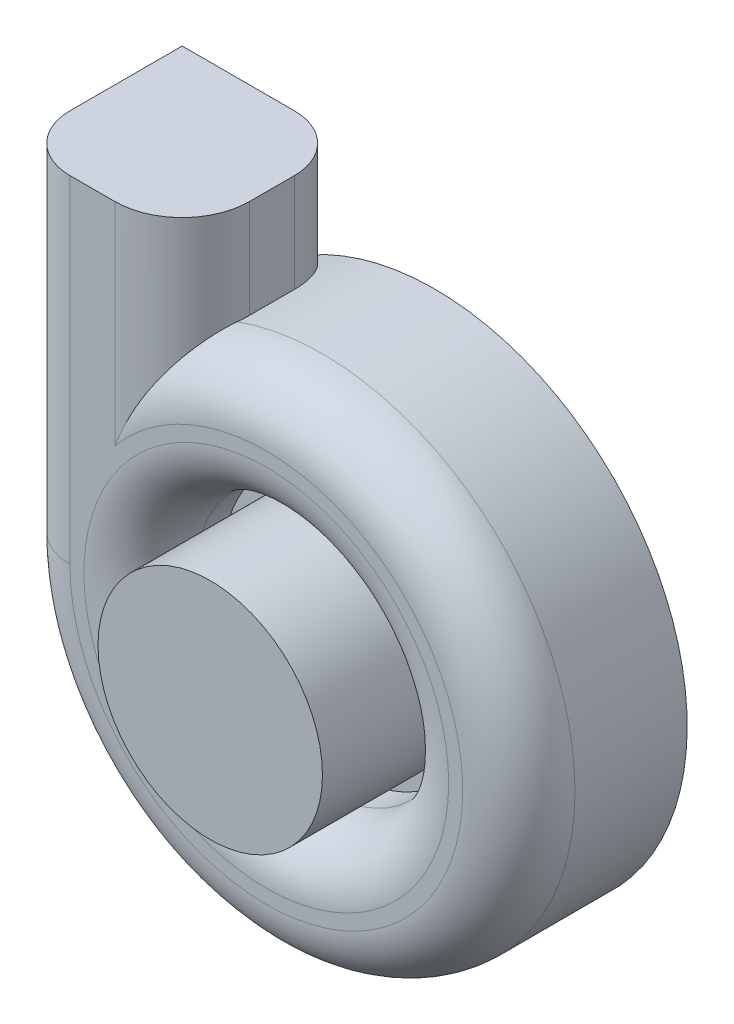
ISO-10303-21;
HEADER;
FILE_DESCRIPTION(('STEP AP214'),'2;1');
FILE_NAME('part.step','',(''),(''),'','','');
FILE_SCHEMA(('AUTOMOTIVE_DESIGN { 1 0 10303 214 1 1 1 1 }'));
ENDSEC;
DATA;
#1=APPLICATION_CONTEXT('core data for automotive mechanical design processes');
#2=APPLICATION_PROTOCOL_DEFINITION('international standard','automotive_design',2000,#1);
#3=PRODUCT_CONTEXT('',#1,'mechanical');
#4=PRODUCT('Part','Part','',(#3));
#5=PRODUCT_RELATED_PRODUCT_CATEGORY('part','',(#4));
#6=PRODUCT_DEFINITION_FORMATION('','',#4);
#7=PRODUCT_DEFINITION_CONTEXT('part definition',#1,'design');
#8=PRODUCT_DEFINITION('design','',#6,#7);
#9=PRODUCT_DEFINITION_SHAPE('','',#8);
#10=(LENGTH_UNIT() NAMED_UNIT(*) SI_UNIT(.MILLI.,.METRE.));
#11=(NAMED_UNIT(*) PLANE_ANGLE_UNIT() SI_UNIT($,.RADIAN.));
#12=(NAMED_UNIT(*) SI_UNIT($,.STERADIAN.) SOLID_ANGLE_UNIT());
#13=UNCERTAINTY_MEASURE_WITH_UNIT(LENGTH_MEASURE(1.E-05),#10,'distance_accuracy_value','');
#14=(GEOMETRIC_REPRESENTATION_CONTEXT(3) GLOBAL_UNCERTAINTY_ASSIGNED_CONTEXT((#13)) GLOBAL_UNIT_ASSIGNED_CONTEXT((#10,
#11,#12)) REPRESENTATION_CONTEXT('',''));
#15=CARTESIAN_POINT('',(0.,0.,0.));
#16=DIRECTION('',(0.,0.,1.));
#17=DIRECTION('',(1.,0.,0.));
#18=AXIS2_PLACEMENT_3D('',#15,#16,#17);
#19=CARTESIAN_POINT('',(0.,0.,30.));
#20=DIRECTION('',(0.,0.,-1.));
#21=DIRECTION('',(-1.,0.,0.));
#22=AXIS2_PLACEMENT_3D('',#19,#20,#21);
#23=CYLINDRICAL_SURFACE('',#22,45.);
#24=DIRECTION('',(0.,0.,-1.));
#25=VECTOR('',#24,1.);
#26=CARTESIAN_POINT('',(-15.,42.4264068711928,30.));
#27=LINE('',#26,#25);
#28=CARTESIAN_POINT('',(-15.,42.4264068711928,18.));
#29=VERTEX_POINT('',#28);
#30=CARTESIAN_POINT('',(-15.,42.4264068711928,10.));
#31=VERTEX_POINT('',#30);
#32=EDGE_CURVE('E149',#29,#31,#27,.T.);
#33=ORIENTED_EDGE('',*,*,#32,.F.);
#34=CARTESIAN_POINT('',(-15.,42.4264068711928,18.));
#35=CARTESIAN_POINT('',(-14.9999969168133,42.4264060018883,18.1677120439889));
#36=CARTESIAN_POINT('',(-15.0035159145799,42.42516380893,18.3354238266948));
#37=CARTESIAN_POINT('',(-15.0175610712977,42.4201951475032,18.6701860700675));
#38=CARTESIAN_POINT('',(-15.0280734240947,42.4164735737622,18.8372371826647));
#39=CARTESIAN_POINT('',(-15.0560684834534,42.4065445621586,19.1706800720306));
#40=CARTESIAN_POINT('',(-15.0735511880856,42.4003371249841,19.3370718489818));
#41=CARTESIAN_POINT('',(-15.1154776162361,42.3854077835705,19.6691967519305));
#42=CARTESIAN_POINT('',(-15.1399350004943,42.3766809443649,19.8349279317019));
#43=CARTESIAN_POINT('',(-15.1678404338008,42.3666923015564,20.));
#44=B_SPLINE_CURVE_WITH_KNOTS('',3,(#34,#35,#36,#37,#38,#39,#40,#41,#42,#43),.UNSPECIFIED.,.F.,
.F.,(4,2,2,2,4),(0.,0.503094205939614,1.00519814822031,1.50730195150601,2.01039601983926),.UNSPECIFIED.);
#45=CARTESIAN_POINT('',(-15.1678404338008,42.3666923015564,20.));
#46=VERTEX_POINT('',#45);
#47=EDGE_CURVE('E54',#29,#46,#44,.T.);
#48=ORIENTED_EDGE('',*,*,#47,.T.);
#49=CARTESIAN_POINT('',(0.,0.,20.));
#50=DIRECTION('',(0.,0.,1.));
#51=DIRECTION('',(1.,0.,0.));
#52=AXIS2_PLACEMENT_3D('',#49,#50,#51);
#53=CIRCLE('',#52,45.);
#54=CARTESIAN_POINT('',(-45.,0.,20.));
#55=VERTEX_POINT('',#54);
#56=EDGE_CURVE('E60',#46,#55,#53,.F.);
#57=ORIENTED_EDGE('',*,*,#56,.T.);
#58=DIRECTION('',(0.,0.,-1.));
#59=VECTOR('',#58,1.);
#60=CARTESIAN_POINT('',(-45.,0.,30.));
#61=LINE('',#60,#59);
#62=CARTESIAN_POINT('',(-45.,0.,0.));
#63=VERTEX_POINT('',#62);
#64=EDGE_CURVE('E135',#55,#63,#61,.T.);
#65=ORIENTED_EDGE('',*,*,#64,.T.);
#66=CARTESIAN_POINT('',(0.,0.,0.));
#67=DIRECTION('',(0.,0.,1.));
#68=DIRECTION('',(1.,0.,0.));
#69=AXIS2_PLACEMENT_3D('',#66,#67,#68);
#70=CIRCLE('',#69,45.);
#71=CARTESIAN_POINT('',(-25.,37.4165738677394,0.));
#72=VERTEX_POINT('',#71);
#73=EDGE_CURVE('E124',#63,#72,#70,.T.);
#74=ORIENTED_EDGE('',*,*,#73,.T.);
#75=CARTESIAN_POINT('',(-25.,37.4165738677394,0.));
#76=CARTESIAN_POINT('',(-24.7122354170697,37.6088872813747,-1.09776539202617E-05));
#77=CARTESIAN_POINT('',(-24.4221325026109,37.7978767058268,0.0124237773135069));
#78=CARTESIAN_POINT('',(-23.8390703684014,38.1682756000984,0.0633049804509352));
#79=CARTESIAN_POINT('',(-23.5461090503066,38.3496788884091,0.101772218778692));
#80=CARTESIAN_POINT('',(-22.9577734275687,38.7047753734923,0.206169340417239));
#81=CARTESIAN_POINT('',(-22.6623955328084,38.8784129217357,0.272270374327646));
#82=CARTESIAN_POINT('',(-22.073697737409,39.2156454883352,0.432878344544188));
#83=CARTESIAN_POINT('',(-21.7803773600812,39.3792429057729,0.527378462835709));
#84=CARTESIAN_POINT('',(-21.1970539619994,39.6962931347165,0.746075360989552));
#85=CARTESIAN_POINT('',(-20.9070772616937,39.8496866641181,0.870429098704661));
#86=CARTESIAN_POINT('',(-20.3353500183412,40.1444518215042,1.14888904386928));
#87=CARTESIAN_POINT('',(-20.0536002480079,40.2858223225968,1.30299803579568));
#88=CARTESIAN_POINT('',(-19.5027039024204,40.5553726405875,1.64035462651612));
#89=CARTESIAN_POINT('',(-19.2335218125126,40.6835910296577,1.82351275863351));
#90=CARTESIAN_POINT('',(-18.8414842024484,40.8658697350283,2.11967359391058));
#91=CARTESIAN_POINT('',(-18.7127619316538,40.9249540452388,2.22196354790514));
#92=CARTESIAN_POINT('',(-18.4596078741324,41.039763504553,2.43359434424897));
#93=CARTESIAN_POINT('',(-18.3351774350328,41.095487602593,2.54293737086817));
#94=CARTESIAN_POINT('',(-18.0007058416559,41.2435270020799,2.85202862840482));
#95=CARTESIAN_POINT('',(-17.7955090841175,41.3323781742553,3.05875826869996));
#96=CARTESIAN_POINT('',(-17.4021427775488,41.4995317605347,3.49168822241623));
#97=CARTESIAN_POINT('',(-17.213971504378,41.5778352431779,3.7178865597401));
#98=CARTESIAN_POINT('',(-16.8567994759065,41.7239208297254,4.18832731480651));
#99=CARTESIAN_POINT('',(-16.6878083737518,41.7916976419514,4.43257871722449));
#100=CARTESIAN_POINT('',(-16.3712247025912,41.9167268568307,4.93710427462043));
#101=CARTESIAN_POINT('',(-16.223630227561,41.9739801970431,5.1973769994632));
#102=CARTESIAN_POINT('',(-15.9639471615528,42.0733875966293,5.70766136304047));
#103=CARTESIAN_POINT('',(-15.8498572213613,42.1164375555828,5.95648280717363));
#104=CARTESIAN_POINT('',(-15.6421021009341,42.194039243362,6.46377905258751));
#105=CARTESIAN_POINT('',(-15.548435261404,42.2285916626079,6.72225306763572));
#106=CARTESIAN_POINT('',(-15.3826094982422,42.2892790515567,7.24658235468172));
#107=CARTESIAN_POINT('',(-15.3104218592813,42.3154252632374,7.51242724778165));
#108=CARTESIAN_POINT('',(-15.1881563852536,42.3594631340105,8.04971859378457));
#109=CARTESIAN_POINT('',(-15.1380691953889,42.3773582858008,8.32116262562583));
#110=CARTESIAN_POINT('',(-15.0662400048846,42.4029444077792,8.82711791735254));
#111=CARTESIAN_POINT('',(-15.0413964684581,42.4117549127802,9.06113806297079));
#112=CARTESIAN_POINT('',(-15.0082804211469,42.4234790391477,9.53010091966076));
#113=CARTESIAN_POINT('',(-14.9999802863087,42.4264024907229,9.76504143536043));
#114=CARTESIAN_POINT('',(-15.,42.4264068711929,10.));
#115=B_SPLINE_CURVE_WITH_KNOTS('',3,(#75,#76,#77,#78,#79,#80,#81,#82,#83,#84,#85,#86,#87,#88,
#89,#90,#91,#92,#93,#94,#95,#96,#97,#98,#99,#100,#101,#102,#103,#104,#105,#106,#107,#108,#109,
#110,#111,#112,#113,#114),.UNSPECIFIED.,.F.,.F.,(4,2,2,2,2,2,2,2,2,2,2,2,2,2,2,2,2,2,2,4),(0.,
1.03823178285201,2.07729370221055,3.12288872074482,4.1682329144772,5.21919832862696,
6.27026213912893,7.3181495505984,7.84208462674894,8.36618274698024,9.27842286330302,
10.1905704950541,11.1031751827588,12.0156985250727,12.8459581562876,13.6761503071006,
14.5052275434331,15.3339535060117,16.0398097361198,16.7444863460868),.UNSPECIFIED.);
#116=EDGE_CURVE('E188',#72,#31,#115,.T.);
#117=ORIENTED_EDGE('',*,*,#116,.T.);
#118=EDGE_LOOP('',(#33,#48,#57,#65,#74,#117));
#119=FACE_BOUND('',#118,.T.);
#120=ADVANCED_FACE('F39',(#119),#23,.T.);
#121=CARTESIAN_POINT('',(-15.,42.4264068711928,30.));
#122=DIRECTION('',(-1.,0.,0.));
#123=DIRECTION('',(0.,0.,1.));
#124=AXIS2_PLACEMENT_3D('',#121,#122,#123);
#125=PLANE('',#124);
#126=DIRECTION('',(0.,0.,-1.));
#127=VECTOR('',#126,1.);
#128=CARTESIAN_POINT('',(-15.,60.,30.));
#129=LINE('',#128,#127);
#130=CARTESIAN_POINT('',(-15.,60.,18.));
#131=VERTEX_POINT('',#130);
#132=CARTESIAN_POINT('',(-15.,60.,10.));
#133=VERTEX_POINT('',#132);
#134=EDGE_CURVE('E134',#131,#133,#129,.T.);
#135=ORIENTED_EDGE('',*,*,#134,.F.);
#136=DIRECTION('',(0.,1.,0.));
#137=VECTOR('',#136,1.);
#138=CARTESIAN_POINT('',(-15.,31.6227766016838,18.));
#139=LINE('',#138,#137);
#140=EDGE_CURVE('E68',#131,#29,#139,.F.);
#141=ORIENTED_EDGE('',*,*,#140,.T.);
#142=ORIENTED_EDGE('',*,*,#32,.T.);
#143=DIRECTION('',(0.,1.,0.));
#144=VECTOR('',#143,1.);
#145=CARTESIAN_POINT('',(-15.,42.4264068711928,10.));
#146=LINE('',#145,#144);
#147=EDGE_CURVE('E174',#31,#133,#146,.T.);
#148=ORIENTED_EDGE('',*,*,#147,.T.);
#149=EDGE_LOOP('',(#135,#141,#142,#148));
#150=FACE_BOUND('',#149,.T.);
#151=ADVANCED_FACE('F222',(#150),#125,.F.);
#152=CARTESIAN_POINT('',(-45.,60.,30.));
#153=DIRECTION('',(0.,-1.,0.));
#154=DIRECTION('',(0.,0.,-1.));
#155=AXIS2_PLACEMENT_3D('',#152,#153,#154);
#156=PLANE('',#155);
#157=DIRECTION('',(-1.,0.,0.));
#158=VECTOR('',#157,1.);
#159=CARTESIAN_POINT('',(-45.,60.,30.));
#160=LINE('',#159,#158);
#161=CARTESIAN_POINT('',(-27.,60.,30.));
#162=VERTEX_POINT('',#161);
#163=CARTESIAN_POINT('',(-35.,60.,30.));
#164=VERTEX_POINT('',#163);
#165=EDGE_CURVE('E139',#162,#164,#160,.T.);
#166=ORIENTED_EDGE('',*,*,#165,.F.);
#167=CARTESIAN_POINT('',(-27.,60.,18.));
#168=DIRECTION('',(0.,-1.,0.));
#169=DIRECTION('',(0.,0.,-1.));
#170=AXIS2_PLACEMENT_3D('',#167,#168,#169);
#171=CIRCLE('',#170,12.);
#172=EDGE_CURVE('E235',#162,#131,#171,.F.);
#173=ORIENTED_EDGE('',*,*,#172,.T.);
#174=ORIENTED_EDGE('',*,*,#134,.T.);
#175=CARTESIAN_POINT('',(-25.,60.,10.));
#176=DIRECTION('',(0.,-1.,0.));
#177=DIRECTION('',(0.,0.,-1.));
#178=AXIS2_PLACEMENT_3D('',#175,#176,#177);
#179=CIRCLE('',#178,10.);
#180=CARTESIAN_POINT('',(-25.,60.,0.));
#181=VERTEX_POINT('',#180);
#182=EDGE_CURVE('E117',#133,#181,#179,.F.);
#183=ORIENTED_EDGE('',*,*,#182,.T.);
#184=DIRECTION('',(-1.,0.,0.));
#185=VECTOR('',#184,1.);
#186=CARTESIAN_POINT('',(-45.,60.,0.));
#187=LINE('',#186,#185);
#188=CARTESIAN_POINT('',(-45.,60.,0.));
#189=VERTEX_POINT('',#188);
#190=EDGE_CURVE('E109',#181,#189,#187,.T.);
#191=ORIENTED_EDGE('',*,*,#190,.T.);
#192=DIRECTION('',(0.,0.,-1.));
#193=VECTOR('',#192,1.);
#194=CARTESIAN_POINT('',(-45.,60.,30.));
#195=LINE('',#194,#193);
#196=CARTESIAN_POINT('',(-45.,60.,20.));
#197=VERTEX_POINT('',#196);
#198=EDGE_CURVE('E114',#197,#189,#195,.T.);
#199=ORIENTED_EDGE('',*,*,#198,.F.);
#200=CARTESIAN_POINT('',(-35.,60.,20.));
#201=DIRECTION('',(0.,-1.,0.));
#202=DIRECTION('',(0.,0.,-1.));
#203=AXIS2_PLACEMENT_3D('',#200,#201,#202);
#204=CIRCLE('',#203,10.);
#205=EDGE_CURVE('E165',#197,#164,#204,.F.);
#206=ORIENTED_EDGE('',*,*,#205,.T.);
#207=EDGE_LOOP('',(#166,#173,#174,#183,#191,#199,#206));
#208=FACE_BOUND('',#207,.T.);
#209=ADVANCED_FACE('F112',(#208),#156,.F.);
#210=CARTESIAN_POINT('',(-45.,0.,30.));
#211=DIRECTION('',(1.,0.,0.));
#212=DIRECTION('',(0.,0.,-1.));
#213=AXIS2_PLACEMENT_3D('',#210,#211,#212);
#214=PLANE('',#213);
#215=ORIENTED_EDGE('',*,*,#64,.F.);
#216=DIRECTION('',(0.,-1.,0.));
#217=VECTOR('',#216,1.);
#218=CARTESIAN_POINT('',(-45.,60.,20.));
#219=LINE('',#218,#217);
#220=EDGE_CURVE('E132',#55,#197,#219,.F.);
#221=ORIENTED_EDGE('',*,*,#220,.T.);
#222=ORIENTED_EDGE('',*,*,#198,.T.);
#223=DIRECTION('',(0.,-1.,0.));
#224=VECTOR('',#223,1.);
#225=CARTESIAN_POINT('',(-45.,0.,0.));
#226=LINE('',#225,#224);
#227=EDGE_CURVE('E123',#189,#63,#226,.T.);
#228=ORIENTED_EDGE('',*,*,#227,.T.);
#229=EDGE_LOOP('',(#215,#221,#222,#228));
#230=FACE_BOUND('',#229,.T.);
#231=ADVANCED_FACE('F129',(#230),#214,.F.);
#232=CARTESIAN_POINT('',(0.,0.,30.));
#233=DIRECTION('',(0.,0.,1.));
#234=DIRECTION('',(1.,0.,0.));
#235=AXIS2_PLACEMENT_3D('',#232,#233,#234);
#236=PLANE('',#235);
#237=CARTESIAN_POINT('',(0.,0.,30.));
#238=DIRECTION('',(0.,0.,1.));
#239=DIRECTION('',(1.,0.,0.));
#240=AXIS2_PLACEMENT_3D('',#237,#238,#239);
#241=CIRCLE('',#240,32.5);
#242=CARTESIAN_POINT('',(32.5,0.,30.));
#243=VERTEX_POINT('',#242);
#244=EDGE_CURVE('E159',#243,#243,#241,.F.);
#245=ORIENTED_EDGE('',*,*,#244,.T.);
#246=EDGE_LOOP('',(#245));
#247=FACE_BOUND('',#246,.T.);
#248=CARTESIAN_POINT('',(0.,0.,30.));
#249=DIRECTION('',(0.,0.,1.));
#250=DIRECTION('',(1.,0.,0.));
#251=AXIS2_PLACEMENT_3D('',#248,#249,#250);
#252=CIRCLE('',#251,35.);
#253=CARTESIAN_POINT('',(-35.,0.,30.));
#254=VERTEX_POINT('',#253);
#255=CARTESIAN_POINT('',(-27.,22.2710574513201,30.));
#256=VERTEX_POINT('',#255);
#257=EDGE_CURVE('E152',#254,#256,#252,.T.);
#258=ORIENTED_EDGE('',*,*,#257,.T.);
#259=DIRECTION('',(0.,1.,0.));
#260=VECTOR('',#259,1.);
#261=CARTESIAN_POINT('',(-27.,60.,30.));
#262=LINE('',#261,#260);
#263=EDGE_CURVE('E197',#256,#162,#262,.T.);
#264=ORIENTED_EDGE('',*,*,#263,.T.);
#265=ORIENTED_EDGE('',*,*,#165,.T.);
#266=DIRECTION('',(0.,-1.,0.));
#267=VECTOR('',#266,1.);
#268=CARTESIAN_POINT('',(-35.,0.,30.));
#269=LINE('',#268,#267);
#270=EDGE_CURVE('E155',#164,#254,#269,.T.);
#271=ORIENTED_EDGE('',*,*,#270,.T.);
#272=EDGE_LOOP('',(#258,#264,#265,#271));
#273=FACE_BOUND('',#272,.T.);
#274=ADVANCED_FACE('F245',(#247,#273),#236,.T.);
#275=CARTESIAN_POINT('',(0.,0.,0.));
#276=DIRECTION('',(0.,0.,1.));
#277=DIRECTION('',(1.,0.,0.));
#278=AXIS2_PLACEMENT_3D('',#275,#276,#277);
#279=PLANE('',#278);
#280=ORIENTED_EDGE('',*,*,#190,.F.);
#281=DIRECTION('',(0.,1.,0.));
#282=VECTOR('',#281,1.);
#283=CARTESIAN_POINT('',(-25.,0.,0.));
#284=LINE('',#283,#282);
#285=EDGE_CURVE('E185',#181,#72,#284,.F.);
#286=ORIENTED_EDGE('',*,*,#285,.T.);
#287=ORIENTED_EDGE('',*,*,#73,.F.);
#288=ORIENTED_EDGE('',*,*,#227,.F.);
#289=EDGE_LOOP('',(#280,#286,#287,#288));
#290=FACE_BOUND('',#289,.T.);
#291=ADVANCED_FACE('F137',(#290),#279,.F.);
#292=CARTESIAN_POINT('',(0.,0.,15.));
#293=DIRECTION('',(0.,0.,1.));
#294=DIRECTION('',(1.,0.,0.));
#295=AXIS2_PLACEMENT_3D('',#292,#293,#294);
#296=CYLINDRICAL_SURFACE('',#295,22.5);
#297=CARTESIAN_POINT('',(0.,0.,20.));
#298=DIRECTION('',(0.,0.,1.));
#299=DIRECTION('',(1.,0.,0.));
#300=AXIS2_PLACEMENT_3D('',#297,#298,#299);
#301=CIRCLE('',#300,22.5);
#302=CARTESIAN_POINT('',(22.5,0.,20.));
#303=VERTEX_POINT('',#302);
#304=EDGE_CURVE('E168',#303,#303,#301,.T.);
#305=ORIENTED_EDGE('',*,*,#304,.T.);
#306=EDGE_LOOP('',(#305));
#307=FACE_BOUND('',#306,.T.);
#308=CARTESIAN_POINT('',(0.,0.,15.));
#309=DIRECTION('',(0.,0.,1.));
#310=DIRECTION('',(1.,0.,0.));
#311=AXIS2_PLACEMENT_3D('',#308,#309,#310);
#312=CIRCLE('',#311,22.5);
#313=CARTESIAN_POINT('',(22.5,0.,15.));
#314=VERTEX_POINT('',#313);
#315=EDGE_CURVE('E178',#314,#314,#312,.T.);
#316=ORIENTED_EDGE('',*,*,#315,.F.);
#317=EDGE_LOOP('',(#316));
#318=FACE_BOUND('',#317,.T.);
#319=ADVANCED_FACE('F255',(#307,#318),#296,.F.);
#320=CARTESIAN_POINT('',(0.,0.,15.));
#321=DIRECTION('',(0.,0.,1.));
#322=DIRECTION('',(1.,0.,0.));
#323=AXIS2_PLACEMENT_3D('',#320,#321,#322);
#324=PLANE('',#323);
#325=CARTESIAN_POINT('',(0.,0.,15.));
#326=DIRECTION('',(0.,0.,1.));
#327=DIRECTION('',(1.,0.,0.));
#328=AXIS2_PLACEMENT_3D('',#325,#326,#327);
#329=CIRCLE('',#328,20.);
#330=CARTESIAN_POINT('',(20.,0.,15.));
#331=VERTEX_POINT('',#330);
#332=EDGE_CURVE('E360',#331,#331,#329,.T.);
#333=ORIENTED_EDGE('',*,*,#332,.F.);
#334=EDGE_LOOP('',(#333));
#335=FACE_BOUND('',#334,.T.);
#336=ORIENTED_EDGE('',*,*,#315,.T.);
#337=EDGE_LOOP('',(#336));
#338=FACE_BOUND('',#337,.T.);
#339=ADVANCED_FACE('F216',(#335,#338),#324,.T.);
#340=CARTESIAN_POINT('',(0.,0.,20.));
#341=DIRECTION('',(0.,0.,1.));
#342=DIRECTION('',(1.,0.,0.));
#343=AXIS2_PLACEMENT_3D('',#340,#341,#342);
#344=TOROIDAL_SURFACE('',#343,35.,10.);
#345=ORIENTED_EDGE('',*,*,#56,.F.);
#346=CARTESIAN_POINT('',(-15.1678404338008,42.3666923015564,20.));
#347=CARTESIAN_POINT('',(-15.1867473527812,42.3599252352601,20.1118697381065));
#348=CARTESIAN_POINT('',(-15.2072165484767,42.350586426701,20.2232947025504));
#349=CARTESIAN_POINT('',(-15.2511794330355,42.326895579284,20.4449898046371));
#350=CARTESIAN_POINT('',(-15.2746725937468,42.3125444151133,20.555260140314));
#351=CARTESIAN_POINT('',(-15.3494506933658,42.2622287415422,20.883569404463));
#352=CARTESIAN_POINT('',(-15.4051092743639,42.2189744303157,21.0995478039436));
#353=CARTESIAN_POINT('',(-15.5262227764234,42.1151061114018,21.5213709343555));
#354=CARTESIAN_POINT('',(-15.5915504025834,42.0547094967094,21.7273069292682));
#355=CARTESIAN_POINT('',(-15.7313191656886,41.9179418464133,22.1306670715904));
#356=CARTESIAN_POINT('',(-15.8057638774774,41.8415645363487,22.3280878388559));
#357=CARTESIAN_POINT('',(-15.9619712290469,41.6751003689273,22.7121776213323));
#358=CARTESIAN_POINT('',(-16.0436801294674,41.5851112153498,22.8989111368066));
#359=CARTESIAN_POINT('',(-16.2136556197666,41.3926730552983,23.2626119417163));
#360=CARTESIAN_POINT('',(-16.3019215080592,41.2902253811188,23.4395802724879));
#361=CARTESIAN_POINT('',(-16.5755590540419,40.9656878821433,23.9567994313449));
#362=CARTESIAN_POINT('',(-16.7693206565898,40.7268867715307,24.2822855053745));
#363=CARTESIAN_POINT('',(-17.1404038248288,40.2549582376106,24.8472217784552));
#364=CARTESIAN_POINT('',(-17.3156492601016,40.0266403199493,25.0921980950816));
#365=CARTESIAN_POINT('',(-17.6734484356343,39.5502552987959,25.556542244424));
#366=CARTESIAN_POINT('',(-17.8560064806495,39.3021764750114,25.7758946863991));
#367=CARTESIAN_POINT('',(-18.2259879952197,38.7896809586003,26.1911049811269));
#368=CARTESIAN_POINT('',(-18.4134195467973,38.5252359706396,26.3869203186081));
#369=CARTESIAN_POINT('',(-18.7907921607488,37.9832817922964,26.7566351947606));
#370=CARTESIAN_POINT('',(-18.980732967079,37.7057739275509,26.9305369506918));
#371=CARTESIAN_POINT('',(-19.3360123878798,37.1778516926175,27.2363742449015));
#372=CARTESIAN_POINT('',(-19.5012339705587,36.9287953837851,27.3708101190582));
#373=CARTESIAN_POINT('',(-19.8315977638544,36.4236356993267,27.6258784097561));
#374=CARTESIAN_POINT('',(-19.9967399582225,36.1675312386421,27.7465086860211));
#375=CARTESIAN_POINT('',(-20.4911857286583,35.3898071330213,28.0894277035831));
#376=CARTESIAN_POINT('',(-20.8193675195504,34.8589861174126,28.292626179923));
#377=CARTESIAN_POINT('',(-21.4688783136888,33.7780642207089,28.655758346667));
#378=CARTESIAN_POINT('',(-21.7901982638854,33.2279401293778,28.8156377853253));
#379=CARTESIAN_POINT('',(-22.4227519092832,32.1128519481777,29.098139975024));
#380=CARTESIAN_POINT('',(-22.7339884957743,31.5478921979132,29.2207734919026));
#381=CARTESIAN_POINT('',(-23.3040359359648,30.4812335476508,29.4200920573241));
#382=CARTESIAN_POINT('',(-23.5643369526332,29.9810484079259,29.5007087388626));
#383=CARTESIAN_POINT('',(-24.0748543303277,28.9726922241644,29.6410308773648));
#384=CARTESIAN_POINT('',(-24.325070732979,28.4645212131023,29.7007364206488));
#385=CARTESIAN_POINT('',(-24.8142366694617,27.4419272553643,29.8018946582644));
#386=CARTESIAN_POINT('',(-25.0532019397334,26.9275143879027,29.8433735660404));
#387=CARTESIAN_POINT('',(-25.5195647123152,25.8925086840346,29.9106591774616));
#388=CARTESIAN_POINT('',(-25.74696249184,25.3719159960963,29.9364662568443));
#389=CARTESIAN_POINT('',(-26.2662334830899,24.1439751450088,29.9812789967928));
#390=CARTESIAN_POINT('',(-26.5531917144987,23.4343334729896,29.994841759242));
#391=CARTESIAN_POINT('',(-26.8828201721441,22.5794961136294,29.999550369036));
#392=CARTESIAN_POINT('',(-26.9366534536008,22.4385458835672,29.9999515106948));
#393=CARTESIAN_POINT('',(-26.9933573461738,22.2886349281953,29.9999986228012));
#394=CARTESIAN_POINT('',(-26.9966795522648,22.2798465253093,30.0000000010243));
#395=CARTESIAN_POINT('',(-27.,22.2710574513201,30.));
#396=B_SPLINE_CURVE_WITH_KNOTS('',3,(#346,#347,#348,#349,#350,#351,#352,#353,#354,#355,#356,
#357,#358,#359,#360,#361,#362,#363,#364,#365,#366,#367,#368,#369,#370,#371,#372,#373,#374,#375,
#376,#377,#378,#379,#380,#381,#382,#383,#384,#385,#386,#387,#388,#389,#390,#391,#392,#393,#394,
#395),.UNSPECIFIED.,.F.,.F.,(4,2,2,2,2,2,2,2,2,2,2,2,2,2,2,2,2,2,2,2,2,2,2,2,4),(0.,
0.34088682064251,0.681714184105567,1.36203030394823,2.03407735434034,2.7063887657189,
3.37408529635437,4.04171048726348,5.3807193504469,6.51312974214263,7.64621684583738,
8.78132084020839,9.9163098901135,10.8990746646739,11.8819915910609,13.8486588477726,
15.8177778458287,17.7863271322239,19.4945625888953,21.2027909939537,22.9085545288662,
24.6142771659141,26.9101858455829,27.3628301673883,27.3910162939743),.UNSPECIFIED.);
#397=EDGE_CURVE('E11',#46,#256,#396,.T.);
#398=ORIENTED_EDGE('',*,*,#397,.T.);
#399=ORIENTED_EDGE('',*,*,#257,.F.);
#400=CARTESIAN_POINT('',(-35.,0.,20.));
#401=DIRECTION('',(0.,1.,0.));
#402=DIRECTION('',(0.,0.,1.));
#403=AXIS2_PLACEMENT_3D('',#400,#401,#402);
#404=CIRCLE('',#403,10.);
#405=EDGE_CURVE('E175',#55,#254,#404,.T.);
#406=ORIENTED_EDGE('',*,*,#405,.F.);
#407=EDGE_LOOP('',(#345,#398,#399,#406));
#408=FACE_BOUND('',#407,.T.);
#409=ADVANCED_FACE('F213',(#408),#344,.T.);
#410=CARTESIAN_POINT('',(-35.,0.,20.));
#411=DIRECTION('',(0.,1.,0.));
#412=DIRECTION('',(0.,0.,1.));
#413=AXIS2_PLACEMENT_3D('',#410,#411,#412);
#414=CYLINDRICAL_SURFACE('',#413,10.);
#415=ORIENTED_EDGE('',*,*,#205,.F.);
#416=ORIENTED_EDGE('',*,*,#220,.F.);
#417=ORIENTED_EDGE('',*,*,#405,.T.);
#418=ORIENTED_EDGE('',*,*,#270,.F.);
#419=EDGE_LOOP('',(#415,#416,#417,#418));
#420=FACE_BOUND('',#419,.T.);
#421=ADVANCED_FACE('F211',(#420),#414,.T.);
#422=CARTESIAN_POINT('',(0.,0.,20.));
#423=DIRECTION('',(0.,0.,1.));
#424=DIRECTION('',(1.,0.,0.));
#425=AXIS2_PLACEMENT_3D('',#422,#423,#424);
#426=TOROIDAL_SURFACE('',#425,32.5,10.);
#427=ORIENTED_EDGE('',*,*,#244,.F.);
#428=EDGE_LOOP('',(#427));
#429=FACE_BOUND('',#428,.T.);
#430=ORIENTED_EDGE('',*,*,#304,.F.);
#431=EDGE_LOOP('',(#430));
#432=FACE_BOUND('',#431,.T.);
#433=ADVANCED_FACE('F208',(#429,#432),#426,.T.);
#434=CARTESIAN_POINT('',(0.,0.,40.));
#435=DIRECTION('',(0.,0.,-1.));
#436=DIRECTION('',(-1.,0.,0.));
#437=AXIS2_PLACEMENT_3D('',#434,#435,#436);
#438=CYLINDRICAL_SURFACE('',#437,20.);
#439=CARTESIAN_POINT('',(0.,0.,40.));
#440=DIRECTION('',(0.,0.,1.));
#441=DIRECTION('',(1.,0.,0.));
#442=AXIS2_PLACEMENT_3D('',#439,#440,#441);
#443=CIRCLE('',#442,20.);
#444=CARTESIAN_POINT('',(20.,0.,40.));
#445=VERTEX_POINT('',#444);
#446=EDGE_CURVE('E179',#445,#445,#443,.T.);
#447=ORIENTED_EDGE('',*,*,#446,.F.);
#448=EDGE_LOOP('',(#447));
#449=FACE_BOUND('',#448,.T.);
#450=ORIENTED_EDGE('',*,*,#332,.T.);
#451=EDGE_LOOP('',(#450));
#452=FACE_BOUND('',#451,.T.);
#453=ADVANCED_FACE('F210',(#449,#452),#438,.T.);
#454=CARTESIAN_POINT('',(0.,0.,40.));
#455=DIRECTION('',(0.,0.,1.));
#456=DIRECTION('',(1.,0.,0.));
#457=AXIS2_PLACEMENT_3D('',#454,#455,#456);
#458=PLANE('',#457);
#459=ORIENTED_EDGE('',*,*,#446,.T.);
#460=EDGE_LOOP('',(#459));
#461=FACE_BOUND('',#460,.T.);
#462=ADVANCED_FACE('F206',(#461),#458,.T.);
#463=CARTESIAN_POINT('',(-25.,42.4264068711928,10.));
#464=DIRECTION('',(0.,1.,0.));
#465=DIRECTION('',(0.,0.,1.));
#466=AXIS2_PLACEMENT_3D('',#463,#464,#465);
#467=CYLINDRICAL_SURFACE('',#466,10.);
#468=ORIENTED_EDGE('',*,*,#116,.F.);
#469=ORIENTED_EDGE('',*,*,#285,.F.);
#470=ORIENTED_EDGE('',*,*,#182,.F.);
#471=ORIENTED_EDGE('',*,*,#147,.F.);
#472=EDGE_LOOP('',(#468,#469,#470,#471));
#473=FACE_BOUND('',#472,.T.);
#474=ADVANCED_FACE('F202',(#473),#467,.T.);
#475=CARTESIAN_POINT('',(-27.,0.,18.));
#476=DIRECTION('',(0.,-1.,0.));
#477=DIRECTION('',(0.,0.,-1.));
#478=AXIS2_PLACEMENT_3D('',#475,#476,#477);
#479=CYLINDRICAL_SURFACE('',#478,12.);
#480=ORIENTED_EDGE('',*,*,#47,.F.);
#481=ORIENTED_EDGE('',*,*,#140,.F.);
#482=ORIENTED_EDGE('',*,*,#172,.F.);
#483=ORIENTED_EDGE('',*,*,#263,.F.);
#484=ORIENTED_EDGE('',*,*,#397,.F.);
#485=EDGE_LOOP('',(#480,#481,#482,#483,#484));
#486=FACE_BOUND('',#485,.T.);
#487=ADVANCED_FACE('F41',(#486),#479,.T.);
#488=CLOSED_SHELL('',(#120,#151,#209,#231,#274,#291,#319,#339,#409,#421,#433,#453,#462,#474,#487));
#489=MANIFOLD_SOLID_BREP('B2',#488);
#490=ADVANCED_BREP_SHAPE_REPRESENTATION('',(#18,#489),#14);
#491=SHAPE_DEFINITION_REPRESENTATION(#9,#490);
ENDSEC;
END-ISO-10303-21;
